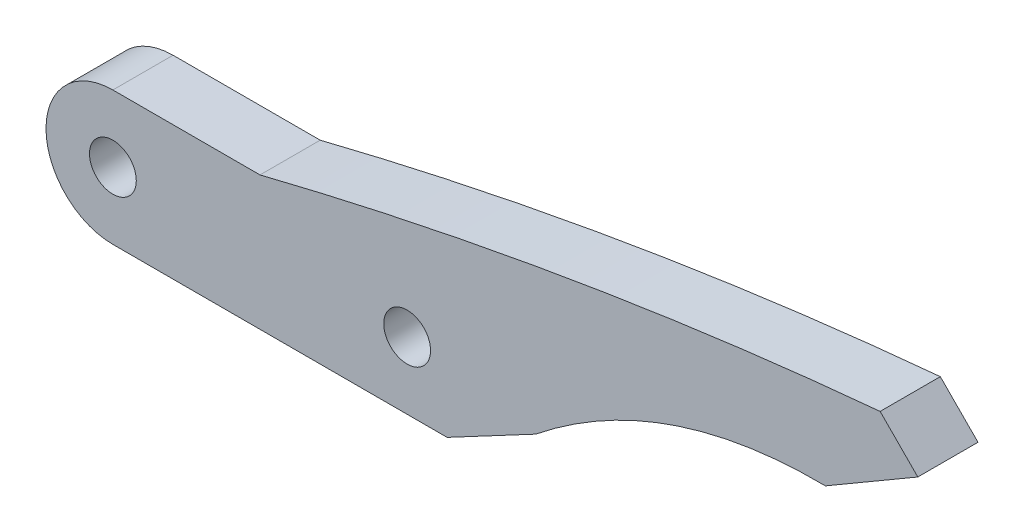
ISO-10303-21;
HEADER;
FILE_DESCRIPTION(('STEP AP214'),'2;1');
FILE_NAME('part.step','',(''),(''),'','','');
FILE_SCHEMA(('AUTOMOTIVE_DESIGN { 1 0 10303 214 1 1 1 1 }'));
ENDSEC;
DATA;
#1=APPLICATION_CONTEXT('core data for automotive mechanical design processes');
#2=APPLICATION_PROTOCOL_DEFINITION('international standard','automotive_design',2000,#1);
#3=PRODUCT_CONTEXT('',#1,'mechanical');
#4=PRODUCT('Part','Part','',(#3));
#5=PRODUCT_RELATED_PRODUCT_CATEGORY('part','',(#4));
#6=PRODUCT_DEFINITION_FORMATION('','',#4);
#7=PRODUCT_DEFINITION_CONTEXT('part definition',#1,'design');
#8=PRODUCT_DEFINITION('design','',#6,#7);
#9=PRODUCT_DEFINITION_SHAPE('','',#8);
#10=(LENGTH_UNIT() NAMED_UNIT(*) SI_UNIT(.MILLI.,.METRE.));
#11=(NAMED_UNIT(*) PLANE_ANGLE_UNIT() SI_UNIT($,.RADIAN.));
#12=(NAMED_UNIT(*) SI_UNIT($,.STERADIAN.) SOLID_ANGLE_UNIT());
#13=UNCERTAINTY_MEASURE_WITH_UNIT(LENGTH_MEASURE(1.E-05),#10,'distance_accuracy_value','');
#14=(GEOMETRIC_REPRESENTATION_CONTEXT(3) GLOBAL_UNCERTAINTY_ASSIGNED_CONTEXT((#13)) GLOBAL_UNIT_ASSIGNED_CONTEXT((#10,
#11,#12)) REPRESENTATION_CONTEXT('',''));
#15=CARTESIAN_POINT('',(0.,0.,0.));
#16=DIRECTION('',(0.,0.,1.));
#17=DIRECTION('',(1.,0.,0.));
#18=AXIS2_PLACEMENT_3D('',#15,#16,#17);
#19=CARTESIAN_POINT('',(0.,-5.,4.5));
#20=DIRECTION('',(0.,-1.,0.));
#21=DIRECTION('',(0.,0.,-1.));
#22=AXIS2_PLACEMENT_3D('',#19,#20,#21);
#23=PLANE('',#22);
#24=DIRECTION('',(-1.,0.,0.));
#25=VECTOR('',#24,1.);
#26=CARTESIAN_POINT('',(0.,-5.,0.));
#27=LINE('',#26,#25);
#28=CARTESIAN_POINT('',(13.99,-5.,0.));
#29=VERTEX_POINT('',#28);
#30=CARTESIAN_POINT('',(-11.,-5.,0.));
#31=VERTEX_POINT('',#30);
#32=EDGE_CURVE('E79',#29,#31,#27,.T.);
#33=ORIENTED_EDGE('',*,*,#32,.F.);
#34=DIRECTION('',(0.,0.,1.));
#35=VECTOR('',#34,1.);
#36=CARTESIAN_POINT('',(13.99,-5.,-52.3267387246768));
#37=LINE('',#36,#35);
#38=CARTESIAN_POINT('',(13.99,-5.,4.5));
#39=VERTEX_POINT('',#38);
#40=EDGE_CURVE('E228',#29,#39,#37,.T.);
#41=ORIENTED_EDGE('',*,*,#40,.T.);
#42=DIRECTION('',(-1.,0.,0.));
#43=VECTOR('',#42,1.);
#44=CARTESIAN_POINT('',(0.,-5.,4.5));
#45=LINE('',#44,#43);
#46=CARTESIAN_POINT('',(-11.,-5.,4.5));
#47=VERTEX_POINT('',#46);
#48=EDGE_CURVE('E81',#39,#47,#45,.T.);
#49=ORIENTED_EDGE('',*,*,#48,.T.);
#50=DIRECTION('',(0.,0.,-1.));
#51=VECTOR('',#50,1.);
#52=CARTESIAN_POINT('',(-11.,-5.,4.5));
#53=LINE('',#52,#51);
#54=EDGE_CURVE('E48',#47,#31,#53,.T.);
#55=ORIENTED_EDGE('',*,*,#54,.T.);
#56=EDGE_LOOP('',(#33,#41,#49,#55));
#57=FACE_BOUND('',#56,.T.);
#58=ADVANCED_FACE('F41',(#57),#23,.T.);
#59=CARTESIAN_POINT('',(0.,5.,4.5));
#60=DIRECTION('',(0.,-1.,0.));
#61=DIRECTION('',(0.,0.,-1.));
#62=AXIS2_PLACEMENT_3D('',#59,#60,#61);
#63=PLANE('',#62);
#64=DIRECTION('',(-1.,0.,0.));
#65=VECTOR('',#64,1.);
#66=CARTESIAN_POINT('',(0.,5.,4.5));
#67=LINE('',#66,#65);
#68=CARTESIAN_POINT('',(0.,5.,4.5));
#69=VERTEX_POINT('',#68);
#70=CARTESIAN_POINT('',(-11.,5.,4.5));
#71=VERTEX_POINT('',#70);
#72=EDGE_CURVE('E55',#69,#71,#67,.T.);
#73=ORIENTED_EDGE('',*,*,#72,.F.);
#74=DIRECTION('',(0.,0.,1.));
#75=VECTOR('',#74,1.);
#76=CARTESIAN_POINT('',(0.,5.,-52.3267387246768));
#77=LINE('',#76,#75);
#78=CARTESIAN_POINT('',(0.,5.,0.));
#79=VERTEX_POINT('',#78);
#80=EDGE_CURVE('E230',#79,#69,#77,.T.);
#81=ORIENTED_EDGE('',*,*,#80,.F.);
#82=DIRECTION('',(-1.,0.,0.));
#83=VECTOR('',#82,1.);
#84=CARTESIAN_POINT('',(0.,5.,0.));
#85=LINE('',#84,#83);
#86=CARTESIAN_POINT('',(-11.,5.,0.));
#87=VERTEX_POINT('',#86);
#88=EDGE_CURVE('E90',#79,#87,#85,.T.);
#89=ORIENTED_EDGE('',*,*,#88,.T.);
#90=DIRECTION('',(0.,0.,-1.));
#91=VECTOR('',#90,1.);
#92=CARTESIAN_POINT('',(-11.,5.,4.5));
#93=LINE('',#92,#91);
#94=EDGE_CURVE('E11',#71,#87,#93,.T.);
#95=ORIENTED_EDGE('',*,*,#94,.F.);
#96=EDGE_LOOP('',(#73,#81,#89,#95));
#97=FACE_BOUND('',#96,.T.);
#98=ADVANCED_FACE('F141',(#97),#63,.F.);
#99=CARTESIAN_POINT('',(-11.,0.,4.5));
#100=DIRECTION('',(0.,0.,-1.));
#101=DIRECTION('',(-1.,0.,0.));
#102=AXIS2_PLACEMENT_3D('',#99,#100,#101);
#103=CYLINDRICAL_SURFACE('',#102,1.75);
#104=CARTESIAN_POINT('',(-11.,0.,4.5));
#105=DIRECTION('',(0.,0.,1.));
#106=DIRECTION('',(1.,0.,0.));
#107=AXIS2_PLACEMENT_3D('',#104,#105,#106);
#108=CIRCLE('',#107,1.75);
#109=CARTESIAN_POINT('',(-9.25,0.,4.5));
#110=VERTEX_POINT('',#109);
#111=EDGE_CURVE('E119',#110,#110,#108,.T.);
#112=ORIENTED_EDGE('',*,*,#111,.T.);
#113=EDGE_LOOP('',(#112));
#114=FACE_BOUND('',#113,.T.);
#115=CARTESIAN_POINT('',(-11.,0.,0.));
#116=DIRECTION('',(0.,0.,1.));
#117=DIRECTION('',(1.,0.,0.));
#118=AXIS2_PLACEMENT_3D('',#115,#116,#117);
#119=CIRCLE('',#118,1.75);
#120=CARTESIAN_POINT('',(-9.25,0.,0.));
#121=VERTEX_POINT('',#120);
#122=EDGE_CURVE('E89',#121,#121,#119,.T.);
#123=ORIENTED_EDGE('',*,*,#122,.F.);
#124=EDGE_LOOP('',(#123));
#125=FACE_BOUND('',#124,.T.);
#126=ADVANCED_FACE('F137',(#114,#125),#103,.F.);
#127=CARTESIAN_POINT('',(-11.,0.,4.5));
#128=DIRECTION('',(0.,0.,-1.));
#129=DIRECTION('',(-1.,0.,0.));
#130=AXIS2_PLACEMENT_3D('',#127,#128,#129);
#131=CYLINDRICAL_SURFACE('',#130,5.);
#132=CARTESIAN_POINT('',(-11.,0.,0.));
#133=DIRECTION('',(0.,0.,1.));
#134=DIRECTION('',(1.,0.,0.));
#135=AXIS2_PLACEMENT_3D('',#132,#133,#134);
#136=CIRCLE('',#135,5.);
#137=EDGE_CURVE('E85',#87,#31,#136,.T.);
#138=ORIENTED_EDGE('',*,*,#137,.T.);
#139=ORIENTED_EDGE('',*,*,#54,.F.);
#140=CARTESIAN_POINT('',(-11.,0.,4.5));
#141=DIRECTION('',(0.,0.,1.));
#142=DIRECTION('',(1.,0.,0.));
#143=AXIS2_PLACEMENT_3D('',#140,#141,#142);
#144=CIRCLE('',#143,5.);
#145=EDGE_CURVE('E63',#71,#47,#144,.T.);
#146=ORIENTED_EDGE('',*,*,#145,.F.);
#147=ORIENTED_EDGE('',*,*,#94,.T.);
#148=EDGE_LOOP('',(#138,#139,#146,#147));
#149=FACE_BOUND('',#148,.T.);
#150=ADVANCED_FACE('F86',(#149),#131,.T.);
#151=CARTESIAN_POINT('',(11.,0.,4.5));
#152=DIRECTION('',(0.,0.,-1.));
#153=DIRECTION('',(-1.,0.,0.));
#154=AXIS2_PLACEMENT_3D('',#151,#152,#153);
#155=CYLINDRICAL_SURFACE('',#154,1.75);
#156=CARTESIAN_POINT('',(11.,0.,4.5));
#157=DIRECTION('',(0.,0.,1.));
#158=DIRECTION('',(1.,0.,0.));
#159=AXIS2_PLACEMENT_3D('',#156,#157,#158);
#160=CIRCLE('',#159,1.75);
#161=CARTESIAN_POINT('',(12.75,0.,4.5));
#162=VERTEX_POINT('',#161);
#163=EDGE_CURVE('E83',#162,#162,#160,.F.);
#164=ORIENTED_EDGE('',*,*,#163,.F.);
#165=EDGE_LOOP('',(#164));
#166=FACE_BOUND('',#165,.T.);
#167=CARTESIAN_POINT('',(11.,0.,0.));
#168=DIRECTION('',(0.,0.,1.));
#169=DIRECTION('',(1.,0.,0.));
#170=AXIS2_PLACEMENT_3D('',#167,#168,#169);
#171=CIRCLE('',#170,1.75);
#172=CARTESIAN_POINT('',(12.75,0.,0.));
#173=VERTEX_POINT('',#172);
#174=EDGE_CURVE('E109',#173,#173,#171,.F.);
#175=ORIENTED_EDGE('',*,*,#174,.T.);
#176=EDGE_LOOP('',(#175));
#177=FACE_BOUND('',#176,.T.);
#178=ADVANCED_FACE('F128',(#166,#177),#155,.F.);
#179=CARTESIAN_POINT('',(0.,0.,4.5));
#180=DIRECTION('',(0.,0.,1.));
#181=DIRECTION('',(1.,0.,0.));
#182=AXIS2_PLACEMENT_3D('',#179,#180,#181);
#183=PLANE('',#182);
#184=ORIENTED_EDGE('',*,*,#48,.F.);
#185=DIRECTION('',(0.882942972945771,0.469480251475697,0.));
#186=VECTOR('',#185,1.);
#187=CARTESIAN_POINT('',(20.61,-1.48,4.5));
#188=LINE('',#187,#186);
#189=CARTESIAN_POINT('',(20.61,-1.47999999999999,4.5));
#190=VERTEX_POINT('',#189);
#191=EDGE_CURVE('E236',#39,#190,#188,.T.);
#192=ORIENTED_EDGE('',*,*,#191,.T.);
#193=CARTESIAN_POINT('',(20.61,-1.47999999999999,4.5));
#194=CARTESIAN_POINT('',(30.1461507480521,6.15734830451269,4.5));
#195=CARTESIAN_POINT('',(42.27,6.00000000000001,4.5));
#196=B_SPLINE_CURVE_WITH_KNOTS('',2,(#193,#194,#195),.UNSPECIFIED.,.F.,.F.,(3,3),(0.,1.),.UNSPECIFIED.);
#197=CARTESIAN_POINT('',(42.27,6.,4.5));
#198=VERTEX_POINT('',#197);
#199=EDGE_CURVE('E234',#190,#198,#196,.T.);
#200=ORIENTED_EDGE('',*,*,#199,.T.);
#201=DIRECTION('',(0.86384948775814,0.50375,0.));
#202=VECTOR('',#201,1.);
#203=CARTESIAN_POINT('',(49.1807959020651,10.03,4.5));
#204=LINE('',#203,#202);
#205=CARTESIAN_POINT('',(49.1807959020651,10.03,4.5));
#206=VERTEX_POINT('',#205);
#207=EDGE_CURVE('E223',#198,#206,#204,.T.);
#208=ORIENTED_EDGE('',*,*,#207,.T.);
#209=DIRECTION('',(-0.70420167565833,0.71,0.));
#210=VECTOR('',#209,1.);
#211=CARTESIAN_POINT('',(49.1807959020651,10.03,4.5));
#212=LINE('',#211,#210);
#213=CARTESIAN_POINT('',(46.3639891994318,12.87,4.5));
#214=VERTEX_POINT('',#213);
#215=EDGE_CURVE('E182',#206,#214,#212,.T.);
#216=ORIENTED_EDGE('',*,*,#215,.T.);
#217=CARTESIAN_POINT('',(46.3639891994318,12.87,4.5));
#218=CARTESIAN_POINT('',(22.8855175011126,10.7079266509718,4.5));
#219=CARTESIAN_POINT('',(0.,5.,4.5));
#220=B_SPLINE_CURVE_WITH_KNOTS('',2,(#217,#218,#219),.UNSPECIFIED.,.F.,.F.,(3,3),(0.,1.),.UNSPECIFIED.);
#221=EDGE_CURVE('E240',#214,#69,#220,.T.);
#222=ORIENTED_EDGE('',*,*,#221,.T.);
#223=ORIENTED_EDGE('',*,*,#72,.T.);
#224=ORIENTED_EDGE('',*,*,#145,.T.);
#225=EDGE_LOOP('',(#184,#192,#200,#208,#216,#222,#223,#224));
#226=FACE_BOUND('',#225,.T.);
#227=ORIENTED_EDGE('',*,*,#111,.F.);
#228=EDGE_LOOP('',(#227));
#229=FACE_BOUND('',#228,.T.);
#230=ORIENTED_EDGE('',*,*,#163,.T.);
#231=EDGE_LOOP('',(#230));
#232=FACE_BOUND('',#231,.T.);
#233=ADVANCED_FACE('F126',(#226,#229,#232),#183,.T.);
#234=CARTESIAN_POINT('',(0.,0.,0.));
#235=DIRECTION('',(0.,0.,1.));
#236=DIRECTION('',(1.,0.,0.));
#237=AXIS2_PLACEMENT_3D('',#234,#235,#236);
#238=PLANE('',#237);
#239=DIRECTION('',(-0.882942972945771,-0.469480251475697,0.));
#240=VECTOR('',#239,1.);
#241=CARTESIAN_POINT('',(20.61,-1.48,0.));
#242=LINE('',#241,#240);
#243=CARTESIAN_POINT('',(20.61,-1.48,0.));
#244=VERTEX_POINT('',#243);
#245=EDGE_CURVE('E96',#244,#29,#242,.T.);
#246=ORIENTED_EDGE('',*,*,#245,.T.);
#247=ORIENTED_EDGE('',*,*,#32,.T.);
#248=ORIENTED_EDGE('',*,*,#137,.F.);
#249=ORIENTED_EDGE('',*,*,#88,.F.);
#250=CARTESIAN_POINT('',(46.3639891994318,12.87,0.));
#251=CARTESIAN_POINT('',(22.8855175011126,10.7079266509718,0.));
#252=CARTESIAN_POINT('',(0.,5.,0.));
#253=B_SPLINE_CURVE_WITH_KNOTS('',2,(#250,#251,#252),.UNSPECIFIED.,.F.,.F.,(3,3),(0.,1.),.UNSPECIFIED.);
#254=CARTESIAN_POINT('',(46.3639891994318,12.87,0.));
#255=VERTEX_POINT('',#254);
#256=EDGE_CURVE('E98',#79,#255,#253,.F.);
#257=ORIENTED_EDGE('',*,*,#256,.T.);
#258=DIRECTION('',(0.70420167565833,-0.710000000000001,0.));
#259=VECTOR('',#258,1.);
#260=CARTESIAN_POINT('',(49.1807959020651,10.03,0.));
#261=LINE('',#260,#259);
#262=CARTESIAN_POINT('',(49.1807959020651,10.03,0.));
#263=VERTEX_POINT('',#262);
#264=EDGE_CURVE('E102',#255,#263,#261,.T.);
#265=ORIENTED_EDGE('',*,*,#264,.T.);
#266=DIRECTION('',(-0.863849487758139,-0.50375,0.));
#267=VECTOR('',#266,1.);
#268=CARTESIAN_POINT('',(49.1807959020651,10.03,0.));
#269=LINE('',#268,#267);
#270=CARTESIAN_POINT('',(42.27,6.00000000000001,0.));
#271=VERTEX_POINT('',#270);
#272=EDGE_CURVE('E200',#263,#271,#269,.T.);
#273=ORIENTED_EDGE('',*,*,#272,.T.);
#274=CARTESIAN_POINT('',(20.61,-1.47999999999999,0.));
#275=CARTESIAN_POINT('',(30.1461507480521,6.15734830451269,0.));
#276=CARTESIAN_POINT('',(42.27,6.00000000000001,0.));
#277=B_SPLINE_CURVE_WITH_KNOTS('',2,(#274,#275,#276),.UNSPECIFIED.,.F.,.F.,(3,3),(0.,1.),.UNSPECIFIED.);
#278=EDGE_CURVE('E212',#271,#244,#277,.F.);
#279=ORIENTED_EDGE('',*,*,#278,.T.);
#280=EDGE_LOOP('',(#246,#247,#248,#249,#257,#265,#273,#279));
#281=FACE_BOUND('',#280,.T.);
#282=ORIENTED_EDGE('',*,*,#122,.T.);
#283=EDGE_LOOP('',(#282));
#284=FACE_BOUND('',#283,.T.);
#285=ORIENTED_EDGE('',*,*,#174,.F.);
#286=EDGE_LOOP('',(#285));
#287=FACE_BOUND('',#286,.T.);
#288=ADVANCED_FACE('F92',(#281,#284,#287),#238,.F.);
#289=CARTESIAN_POINT('',(49.1807959020651,10.03,-52.3267387246768));
#290=DIRECTION('',(0.710000000000001,0.70420167565833,0.));
#291=DIRECTION('',(-0.70420167565833,0.710000000000001,0.));
#292=AXIS2_PLACEMENT_3D('',#289,#290,#291);
#293=PLANE('',#292);
#294=ORIENTED_EDGE('',*,*,#264,.F.);
#295=DIRECTION('',(0.,0.,1.));
#296=VECTOR('',#295,1.);
#297=CARTESIAN_POINT('',(46.3639891994318,12.87,-52.3267387246768));
#298=LINE('',#297,#296);
#299=EDGE_CURVE('E231',#255,#214,#298,.T.);
#300=ORIENTED_EDGE('',*,*,#299,.T.);
#301=ORIENTED_EDGE('',*,*,#215,.F.);
#302=DIRECTION('',(0.,0.,1.));
#303=VECTOR('',#302,1.);
#304=CARTESIAN_POINT('',(49.1807959020651,10.03,-52.3267387246768));
#305=LINE('',#304,#303);
#306=EDGE_CURVE('E204',#263,#206,#305,.T.);
#307=ORIENTED_EDGE('',*,*,#306,.F.);
#308=EDGE_LOOP('',(#294,#300,#301,#307));
#309=FACE_BOUND('',#308,.T.);
#310=ADVANCED_FACE('F154',(#309),#293,.T.);
#311=CARTESIAN_POINT('',(49.1807959020651,10.03,-52.3267387246768));
#312=DIRECTION('',(0.50375,-0.863849487758139,0.));
#313=DIRECTION('',(0.863849487758139,0.50375,0.));
#314=AXIS2_PLACEMENT_3D('',#311,#312,#313);
#315=PLANE('',#314);
#316=ORIENTED_EDGE('',*,*,#272,.F.);
#317=ORIENTED_EDGE('',*,*,#306,.T.);
#318=ORIENTED_EDGE('',*,*,#207,.F.);
#319=DIRECTION('',(0.,0.,1.));
#320=VECTOR('',#319,1.);
#321=CARTESIAN_POINT('',(42.27,6.,-52.3267387246768));
#322=LINE('',#321,#320);
#323=EDGE_CURVE('E208',#271,#198,#322,.T.);
#324=ORIENTED_EDGE('',*,*,#323,.F.);
#325=EDGE_LOOP('',(#316,#317,#318,#324));
#326=FACE_BOUND('',#325,.T.);
#327=ADVANCED_FACE('F158',(#326),#315,.T.);
#328=CARTESIAN_POINT('',(20.61,-1.47999999999999,-52.3267387246768));
#329=CARTESIAN_POINT('',(30.1461507480521,6.15734830451269,-52.3267387246768));
#330=CARTESIAN_POINT('',(42.27,6.00000000000001,-52.3267387246768));
#331=B_SPLINE_CURVE_WITH_KNOTS('',2,(#328,#329,#330),.UNSPECIFIED.,.F.,.F.,(3,3),(0.,1.),.UNSPECIFIED.);
#332=DIRECTION('',(0.,0.,1.));
#333=VECTOR('',#332,1.);
#334=SURFACE_OF_LINEAR_EXTRUSION('',#331,#333);
#335=ORIENTED_EDGE('',*,*,#278,.F.);
#336=ORIENTED_EDGE('',*,*,#323,.T.);
#337=ORIENTED_EDGE('',*,*,#199,.F.);
#338=DIRECTION('',(0.,0.,1.));
#339=VECTOR('',#338,1.);
#340=CARTESIAN_POINT('',(20.61,-1.47999999999999,-52.3267387246768));
#341=LINE('',#340,#339);
#342=EDGE_CURVE('E220',#244,#190,#341,.T.);
#343=ORIENTED_EDGE('',*,*,#342,.F.);
#344=EDGE_LOOP('',(#335,#336,#337,#343));
#345=FACE_BOUND('',#344,.T.);
#346=ADVANCED_FACE('F187',(#345),#334,.T.);
#347=CARTESIAN_POINT('',(20.61,-1.48,-52.3267387246768));
#348=DIRECTION('',(0.469480251475697,-0.882942972945771,0.));
#349=DIRECTION('',(0.882942972945771,0.469480251475697,0.));
#350=AXIS2_PLACEMENT_3D('',#347,#348,#349);
#351=PLANE('',#350);
#352=ORIENTED_EDGE('',*,*,#245,.F.);
#353=ORIENTED_EDGE('',*,*,#342,.T.);
#354=ORIENTED_EDGE('',*,*,#191,.F.);
#355=ORIENTED_EDGE('',*,*,#40,.F.);
#356=EDGE_LOOP('',(#352,#353,#354,#355));
#357=FACE_BOUND('',#356,.T.);
#358=ADVANCED_FACE('F166',(#357),#351,.T.);
#359=CARTESIAN_POINT('',(46.3639891994318,12.87,-52.3267387246768));
#360=CARTESIAN_POINT('',(22.8855175011126,10.7079266509718,-52.3267387246768));
#361=CARTESIAN_POINT('',(0.,5.,-52.3267387246768));
#362=B_SPLINE_CURVE_WITH_KNOTS('',2,(#359,#360,#361),.UNSPECIFIED.,.F.,.F.,(3,3),(0.,1.),.UNSPECIFIED.);
#363=DIRECTION('',(0.,0.,1.));
#364=VECTOR('',#363,1.);
#365=SURFACE_OF_LINEAR_EXTRUSION('',#362,#364);
#366=ORIENTED_EDGE('',*,*,#256,.F.);
#367=ORIENTED_EDGE('',*,*,#80,.T.);
#368=ORIENTED_EDGE('',*,*,#221,.F.);
#369=ORIENTED_EDGE('',*,*,#299,.F.);
#370=EDGE_LOOP('',(#366,#367,#368,#369));
#371=FACE_BOUND('',#370,.T.);
#372=ADVANCED_FACE('F162',(#371),#365,.T.);
#373=CLOSED_SHELL('',(#58,#98,#126,#150,#178,#233,#288,#310,#327,#346,#358,#372));
#374=MANIFOLD_SOLID_BREP('B2',#373);
#375=ADVANCED_BREP_SHAPE_REPRESENTATION('',(#18,#374),#14);
#376=SHAPE_DEFINITION_REPRESENTATION(#9,#375);
ENDSEC;
END-ISO-10303-21;
